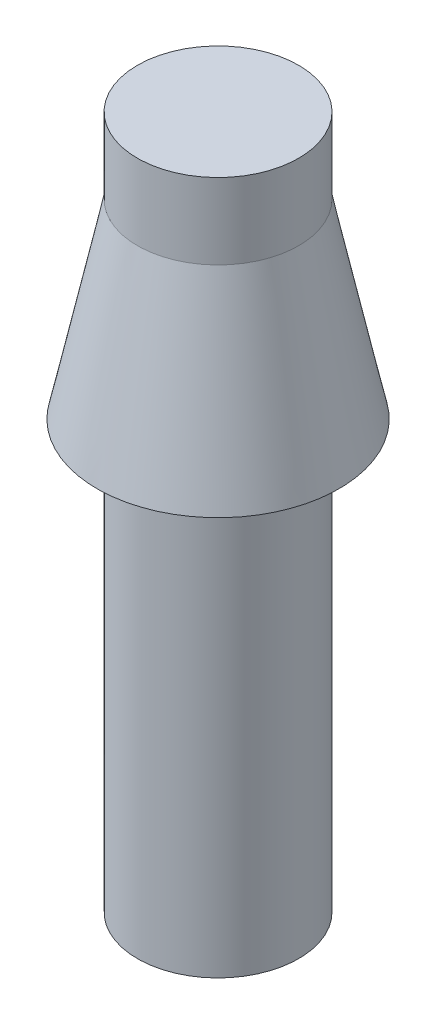
ISO-10303-21;
HEADER;
FILE_DESCRIPTION(('STEP AP214'),'2;1');
FILE_NAME('part.step','',(''),(''),'','','');
FILE_SCHEMA(('AUTOMOTIVE_DESIGN { 1 0 10303 214 1 1 1 1 }'));
ENDSEC;
DATA;
#1=APPLICATION_CONTEXT('core data for automotive mechanical design processes');
#2=APPLICATION_PROTOCOL_DEFINITION('international standard','automotive_design',2000,#1);
#3=PRODUCT_CONTEXT('',#1,'mechanical');
#4=PRODUCT('Part','Part','',(#3));
#5=PRODUCT_RELATED_PRODUCT_CATEGORY('part','',(#4));
#6=PRODUCT_DEFINITION_FORMATION('','',#4);
#7=PRODUCT_DEFINITION_CONTEXT('part definition',#1,'design');
#8=PRODUCT_DEFINITION('design','',#6,#7);
#9=PRODUCT_DEFINITION_SHAPE('','',#8);
#10=(LENGTH_UNIT() NAMED_UNIT(*) SI_UNIT(.MILLI.,.METRE.));
#11=(NAMED_UNIT(*) PLANE_ANGLE_UNIT() SI_UNIT($,.RADIAN.));
#12=(NAMED_UNIT(*) SI_UNIT($,.STERADIAN.) SOLID_ANGLE_UNIT());
#13=UNCERTAINTY_MEASURE_WITH_UNIT(LENGTH_MEASURE(1.E-05),#10,'distance_accuracy_value','');
#14=(GEOMETRIC_REPRESENTATION_CONTEXT(3) GLOBAL_UNCERTAINTY_ASSIGNED_CONTEXT((#13)) GLOBAL_UNIT_ASSIGNED_CONTEXT((#10,
#11,#12)) REPRESENTATION_CONTEXT('',''));
#15=CARTESIAN_POINT('',(0.,0.,0.));
#16=DIRECTION('',(0.,0.,1.));
#17=DIRECTION('',(1.,0.,0.));
#18=AXIS2_PLACEMENT_3D('',#15,#16,#17);
#19=CARTESIAN_POINT('',(0.,26.5,0.));
#20=DIRECTION('',(0.,-1.,0.));
#21=DIRECTION('',(1.,0.,0.));
#22=AXIS2_PLACEMENT_3D('',#19,#20,#21);
#23=CONICAL_SURFACE('',#22,7.50816742770627,0.20943951023932);
#24=CARTESIAN_POINT('',(0.,38.3,0.));
#25=DIRECTION('',(0.,1.,0.));
#26=DIRECTION('',(-1.,0.,0.));
#27=AXIS2_PLACEMENT_3D('',#24,#25,#26);
#28=CIRCLE('',#27,5.);
#29=CARTESIAN_POINT('',(-5.,38.3,0.));
#30=VERTEX_POINT('',#29);
#31=EDGE_CURVE('E10',#30,#30,#28,.T.);
#32=ORIENTED_EDGE('',*,*,#31,.F.);
#33=EDGE_LOOP('',(#32));
#34=FACE_BOUND('',#33,.T.);
#35=CARTESIAN_POINT('',(0.,26.5,0.));
#36=DIRECTION('',(0.,1.,0.));
#37=DIRECTION('',(-1.,0.,0.));
#38=AXIS2_PLACEMENT_3D('',#35,#36,#37);
#39=CIRCLE('',#38,7.50816742770627);
#40=CARTESIAN_POINT('',(-7.50816742770627,26.5,0.));
#41=VERTEX_POINT('',#40);
#42=EDGE_CURVE('E60',#41,#41,#39,.T.);
#43=ORIENTED_EDGE('',*,*,#42,.T.);
#44=EDGE_LOOP('',(#43));
#45=FACE_BOUND('',#44,.T.);
#46=ADVANCED_FACE('F37',(#34,#45),#23,.T.);
#47=CARTESIAN_POINT('',(0.,43.,0.));
#48=DIRECTION('',(0.,1.,0.));
#49=DIRECTION('',(-1.,0.,0.));
#50=AXIS2_PLACEMENT_3D('',#47,#48,#49);
#51=CYLINDRICAL_SURFACE('',#50,5.);
#52=CARTESIAN_POINT('',(0.,43.,0.));
#53=DIRECTION('',(0.,1.,0.));
#54=DIRECTION('',(-1.,0.,0.));
#55=AXIS2_PLACEMENT_3D('',#52,#53,#54);
#56=CIRCLE('',#55,5.);
#57=CARTESIAN_POINT('',(-5.,43.,0.));
#58=VERTEX_POINT('',#57);
#59=EDGE_CURVE('E44',#58,#58,#56,.T.);
#60=ORIENTED_EDGE('',*,*,#59,.F.);
#61=EDGE_LOOP('',(#60));
#62=FACE_BOUND('',#61,.T.);
#63=ORIENTED_EDGE('',*,*,#31,.T.);
#64=EDGE_LOOP('',(#63));
#65=FACE_BOUND('',#64,.T.);
#66=ADVANCED_FACE('F85',(#62,#65),#51,.T.);
#67=CARTESIAN_POINT('',(0.,43.,0.));
#68=DIRECTION('',(0.,-1.,0.));
#69=DIRECTION('',(1.,0.,0.));
#70=AXIS2_PLACEMENT_3D('',#67,#68,#69);
#71=PLANE('',#70);
#72=ORIENTED_EDGE('',*,*,#59,.T.);
#73=EDGE_LOOP('',(#72));
#74=FACE_BOUND('',#73,.T.);
#75=ADVANCED_FACE('F80',(#74),#71,.F.);
#76=CARTESIAN_POINT('',(0.,0.,0.));
#77=DIRECTION('',(0.,1.,0.));
#78=DIRECTION('',(-1.,0.,0.));
#79=AXIS2_PLACEMENT_3D('',#76,#77,#78);
#80=PLANE('',#79);
#81=CARTESIAN_POINT('',(0.,0.,0.));
#82=DIRECTION('',(0.,1.,0.));
#83=DIRECTION('',(-1.,0.,0.));
#84=AXIS2_PLACEMENT_3D('',#81,#82,#83);
#85=CIRCLE('',#84,5.);
#86=CARTESIAN_POINT('',(-5.,0.,0.));
#87=VERTEX_POINT('',#86);
#88=EDGE_CURVE('E49',#87,#87,#85,.T.);
#89=ORIENTED_EDGE('',*,*,#88,.F.);
#90=EDGE_LOOP('',(#89));
#91=FACE_BOUND('',#90,.T.);
#92=ADVANCED_FACE('F75',(#91),#80,.F.);
#93=CARTESIAN_POINT('',(0.,43.,0.));
#94=DIRECTION('',(0.,1.,0.));
#95=DIRECTION('',(-1.,0.,0.));
#96=AXIS2_PLACEMENT_3D('',#93,#94,#95);
#97=CYLINDRICAL_SURFACE('',#96,5.);
#98=CARTESIAN_POINT('',(0.,26.5,0.));
#99=DIRECTION('',(0.,1.,0.));
#100=DIRECTION('',(-1.,0.,0.));
#101=AXIS2_PLACEMENT_3D('',#98,#99,#100);
#102=CIRCLE('',#101,5.);
#103=CARTESIAN_POINT('',(-5.,26.5,0.));
#104=VERTEX_POINT('',#103);
#105=EDGE_CURVE('E54',#104,#104,#102,.T.);
#106=ORIENTED_EDGE('',*,*,#105,.F.);
#107=EDGE_LOOP('',(#106));
#108=FACE_BOUND('',#107,.T.);
#109=ORIENTED_EDGE('',*,*,#88,.T.);
#110=EDGE_LOOP('',(#109));
#111=FACE_BOUND('',#110,.T.);
#112=ADVANCED_FACE('F69',(#108,#111),#97,.T.);
#113=CARTESIAN_POINT('',(0.,26.5,0.));
#114=DIRECTION('',(0.,1.,0.));
#115=DIRECTION('',(-1.,0.,0.));
#116=AXIS2_PLACEMENT_3D('',#113,#114,#115);
#117=PLANE('',#116);
#118=ORIENTED_EDGE('',*,*,#42,.F.);
#119=EDGE_LOOP('',(#118));
#120=FACE_BOUND('',#119,.T.);
#121=ORIENTED_EDGE('',*,*,#105,.T.);
#122=EDGE_LOOP('',(#121));
#123=FACE_BOUND('',#122,.T.);
#124=ADVANCED_FACE('F66',(#120,#123),#117,.F.);
#125=CLOSED_SHELL('',(#46,#66,#75,#92,#112,#124));
#126=MANIFOLD_SOLID_BREP('B2',#125);
#127=ADVANCED_BREP_SHAPE_REPRESENTATION('',(#18,#126),#14);
#128=SHAPE_DEFINITION_REPRESENTATION(#9,#127);
ENDSEC;
END-ISO-10303-21;
